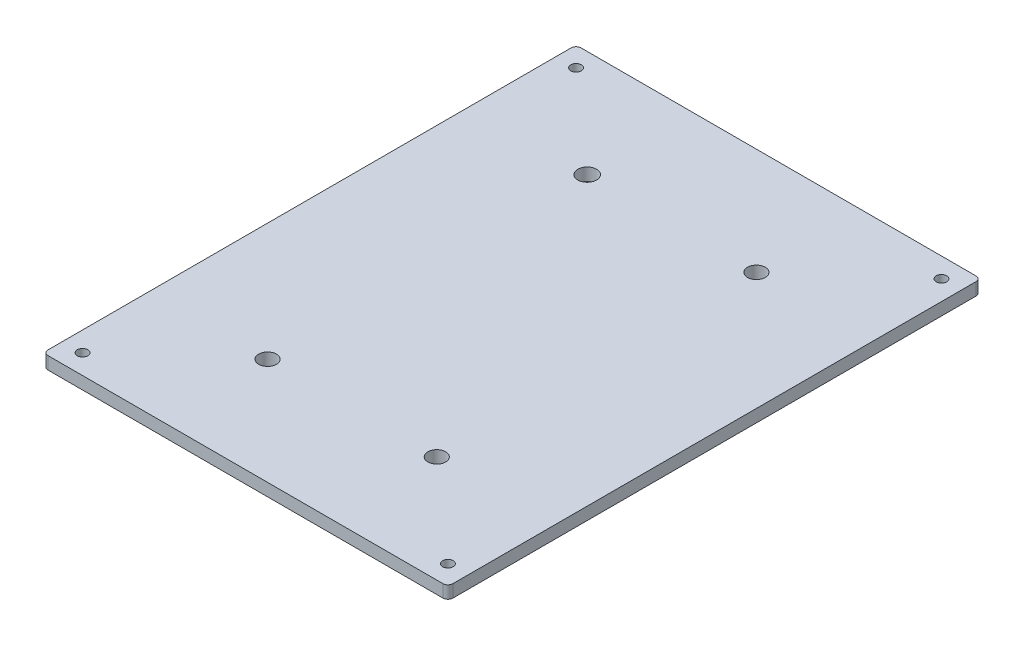
ISO-10303-21;
HEADER;
FILE_DESCRIPTION(('STEP AP214'),'2;1');
FILE_NAME('part.step','',(''),(''),'','','');
FILE_SCHEMA(('AUTOMOTIVE_DESIGN { 1 0 10303 214 1 1 1 1 }'));
ENDSEC;
DATA;
#1=APPLICATION_CONTEXT('core data for automotive mechanical design processes');
#2=APPLICATION_PROTOCOL_DEFINITION('international standard','automotive_design',2000,#1);
#3=PRODUCT_CONTEXT('',#1,'mechanical');
#4=PRODUCT('Part','Part','',(#3));
#5=PRODUCT_RELATED_PRODUCT_CATEGORY('part','',(#4));
#6=PRODUCT_DEFINITION_FORMATION('','',#4);
#7=PRODUCT_DEFINITION_CONTEXT('part definition',#1,'design');
#8=PRODUCT_DEFINITION('design','',#6,#7);
#9=PRODUCT_DEFINITION_SHAPE('','',#8);
#10=(LENGTH_UNIT() NAMED_UNIT(*) SI_UNIT(.MILLI.,.METRE.));
#11=(NAMED_UNIT(*) PLANE_ANGLE_UNIT() SI_UNIT($,.RADIAN.));
#12=(NAMED_UNIT(*) SI_UNIT($,.STERADIAN.) SOLID_ANGLE_UNIT());
#13=UNCERTAINTY_MEASURE_WITH_UNIT(LENGTH_MEASURE(1.E-05),#10,'distance_accuracy_value','');
#14=(GEOMETRIC_REPRESENTATION_CONTEXT(3) GLOBAL_UNCERTAINTY_ASSIGNED_CONTEXT((#13)) GLOBAL_UNIT_ASSIGNED_CONTEXT((#10,
#11,#12)) REPRESENTATION_CONTEXT('',''));
#15=CARTESIAN_POINT('',(0.,0.,0.));
#16=DIRECTION('',(0.,0.,1.));
#17=DIRECTION('',(1.,0.,0.));
#18=AXIS2_PLACEMENT_3D('',#15,#16,#17);
#19=CARTESIAN_POINT('',(-102.55,6.35,-135.));
#20=DIRECTION('',(1.,0.,0.));
#21=DIRECTION('',(0.,0.,-1.));
#22=AXIS2_PLACEMENT_3D('',#19,#20,#21);
#23=PLANE('',#22);
#24=DIRECTION('',(0.,0.,1.));
#25=VECTOR('',#24,1.);
#26=CARTESIAN_POINT('',(-102.55,6.35,-135.));
#27=LINE('',#26,#25);
#28=CARTESIAN_POINT('',(-102.55,6.35,-132.46));
#29=VERTEX_POINT('',#28);
#30=CARTESIAN_POINT('',(-102.55,6.35,132.46));
#31=VERTEX_POINT('',#30);
#32=EDGE_CURVE('E129',#29,#31,#27,.T.);
#33=ORIENTED_EDGE('',*,*,#32,.F.);
#34=DIRECTION('',(0.,-1.,0.));
#35=VECTOR('',#34,1.);
#36=CARTESIAN_POINT('',(-102.55,6.35,-132.46));
#37=LINE('',#36,#35);
#38=CARTESIAN_POINT('',(-102.55,0.,-132.46));
#39=VERTEX_POINT('',#38);
#40=EDGE_CURVE('E114',#29,#39,#37,.T.);
#41=ORIENTED_EDGE('',*,*,#40,.T.);
#42=DIRECTION('',(0.,0.,1.));
#43=VECTOR('',#42,1.);
#44=CARTESIAN_POINT('',(-102.55,0.,-135.));
#45=LINE('',#44,#43);
#46=CARTESIAN_POINT('',(-102.55,0.,132.46));
#47=VERTEX_POINT('',#46);
#48=EDGE_CURVE('E126',#39,#47,#45,.T.);
#49=ORIENTED_EDGE('',*,*,#48,.T.);
#50=DIRECTION('',(0.,-1.,0.));
#51=VECTOR('',#50,1.);
#52=CARTESIAN_POINT('',(-102.55,6.35,132.46));
#53=LINE('',#52,#51);
#54=EDGE_CURVE('E131',#47,#31,#53,.F.);
#55=ORIENTED_EDGE('',*,*,#54,.T.);
#56=EDGE_LOOP('',(#33,#41,#49,#55));
#57=FACE_BOUND('',#56,.T.);
#58=ADVANCED_FACE('F44',(#57),#23,.F.);
#59=CARTESIAN_POINT('',(102.55,6.35,135.));
#60=DIRECTION('',(0.,0.,-1.));
#61=DIRECTION('',(-1.,0.,0.));
#62=AXIS2_PLACEMENT_3D('',#59,#60,#61);
#63=PLANE('',#62);
#64=DIRECTION('',(1.,0.,0.));
#65=VECTOR('',#64,1.);
#66=CARTESIAN_POINT('',(102.55,0.,135.));
#67=LINE('',#66,#65);
#68=CARTESIAN_POINT('',(-100.01,0.,135.));
#69=VERTEX_POINT('',#68);
#70=CARTESIAN_POINT('',(100.01,0.,135.));
#71=VERTEX_POINT('',#70);
#72=EDGE_CURVE('E135',#69,#71,#67,.T.);
#73=ORIENTED_EDGE('',*,*,#72,.T.);
#74=DIRECTION('',(0.,-1.,0.));
#75=VECTOR('',#74,1.);
#76=CARTESIAN_POINT('',(100.01,6.35,135.));
#77=LINE('',#76,#75);
#78=CARTESIAN_POINT('',(100.01,6.35,135.));
#79=VERTEX_POINT('',#78);
#80=EDGE_CURVE('E11',#71,#79,#77,.F.);
#81=ORIENTED_EDGE('',*,*,#80,.T.);
#82=DIRECTION('',(1.,0.,0.));
#83=VECTOR('',#82,1.);
#84=CARTESIAN_POINT('',(102.55,6.35,135.));
#85=LINE('',#84,#83);
#86=CARTESIAN_POINT('',(-100.01,6.35,135.));
#87=VERTEX_POINT('',#86);
#88=EDGE_CURVE('E175',#87,#79,#85,.T.);
#89=ORIENTED_EDGE('',*,*,#88,.F.);
#90=DIRECTION('',(0.,-1.,0.));
#91=VECTOR('',#90,1.);
#92=CARTESIAN_POINT('',(-100.01,6.35,135.));
#93=LINE('',#92,#91);
#94=EDGE_CURVE('E52',#87,#69,#93,.T.);
#95=ORIENTED_EDGE('',*,*,#94,.T.);
#96=EDGE_LOOP('',(#73,#81,#89,#95));
#97=FACE_BOUND('',#96,.T.);
#98=ADVANCED_FACE('F173',(#97),#63,.F.);
#99=CARTESIAN_POINT('',(102.55,6.35,-135.));
#100=DIRECTION('',(-1.,0.,0.));
#101=DIRECTION('',(0.,0.,1.));
#102=AXIS2_PLACEMENT_3D('',#99,#100,#101);
#103=PLANE('',#102);
#104=DIRECTION('',(0.,0.,-1.));
#105=VECTOR('',#104,1.);
#106=CARTESIAN_POINT('',(102.55,0.,-135.));
#107=LINE('',#106,#105);
#108=CARTESIAN_POINT('',(102.55,0.,132.46));
#109=VERTEX_POINT('',#108);
#110=CARTESIAN_POINT('',(102.55,0.,-132.46));
#111=VERTEX_POINT('',#110);
#112=EDGE_CURVE('E139',#109,#111,#107,.T.);
#113=ORIENTED_EDGE('',*,*,#112,.T.);
#114=DIRECTION('',(0.,-1.,0.));
#115=VECTOR('',#114,1.);
#116=CARTESIAN_POINT('',(102.55,6.35,-132.46));
#117=LINE('',#116,#115);
#118=CARTESIAN_POINT('',(102.55,6.35,-132.46));
#119=VERTEX_POINT('',#118);
#120=EDGE_CURVE('E59',#111,#119,#117,.F.);
#121=ORIENTED_EDGE('',*,*,#120,.T.);
#122=DIRECTION('',(0.,0.,-1.));
#123=VECTOR('',#122,1.);
#124=CARTESIAN_POINT('',(102.55,6.35,-135.));
#125=LINE('',#124,#123);
#126=CARTESIAN_POINT('',(102.55,6.35,132.46));
#127=VERTEX_POINT('',#126);
#128=EDGE_CURVE('E183',#127,#119,#125,.T.);
#129=ORIENTED_EDGE('',*,*,#128,.F.);
#130=DIRECTION('',(0.,-1.,0.));
#131=VECTOR('',#130,1.);
#132=CARTESIAN_POINT('',(102.55,6.35,132.46));
#133=LINE('',#132,#131);
#134=EDGE_CURVE('E166',#127,#109,#133,.T.);
#135=ORIENTED_EDGE('',*,*,#134,.T.);
#136=EDGE_LOOP('',(#113,#121,#129,#135));
#137=FACE_BOUND('',#136,.T.);
#138=ADVANCED_FACE('F182',(#137),#103,.F.);
#139=CARTESIAN_POINT('',(102.55,6.35,-135.));
#140=DIRECTION('',(0.,0.,1.));
#141=DIRECTION('',(1.,0.,0.));
#142=AXIS2_PLACEMENT_3D('',#139,#140,#141);
#143=PLANE('',#142);
#144=DIRECTION('',(-1.,0.,0.));
#145=VECTOR('',#144,1.);
#146=CARTESIAN_POINT('',(102.55,0.,-135.));
#147=LINE('',#146,#145);
#148=CARTESIAN_POINT('',(100.01,0.,-135.));
#149=VERTEX_POINT('',#148);
#150=CARTESIAN_POINT('',(-100.01,0.,-135.));
#151=VERTEX_POINT('',#150);
#152=EDGE_CURVE('E149',#149,#151,#147,.T.);
#153=ORIENTED_EDGE('',*,*,#152,.T.);
#154=DIRECTION('',(0.,-1.,0.));
#155=VECTOR('',#154,1.);
#156=CARTESIAN_POINT('',(-100.01,6.35,-135.));
#157=LINE('',#156,#155);
#158=CARTESIAN_POINT('',(-100.01,6.35,-135.));
#159=VERTEX_POINT('',#158);
#160=EDGE_CURVE('E115',#151,#159,#157,.F.);
#161=ORIENTED_EDGE('',*,*,#160,.T.);
#162=DIRECTION('',(-1.,0.,0.));
#163=VECTOR('',#162,1.);
#164=CARTESIAN_POINT('',(102.55,6.35,-135.));
#165=LINE('',#164,#163);
#166=CARTESIAN_POINT('',(100.01,6.35,-135.));
#167=VERTEX_POINT('',#166);
#168=EDGE_CURVE('E145',#167,#159,#165,.T.);
#169=ORIENTED_EDGE('',*,*,#168,.F.);
#170=DIRECTION('',(0.,-1.,0.));
#171=VECTOR('',#170,1.);
#172=CARTESIAN_POINT('',(100.01,6.35,-135.));
#173=LINE('',#172,#171);
#174=EDGE_CURVE('E120',#167,#149,#173,.T.);
#175=ORIENTED_EDGE('',*,*,#174,.T.);
#176=EDGE_LOOP('',(#153,#161,#169,#175));
#177=FACE_BOUND('',#176,.T.);
#178=ADVANCED_FACE('F239',(#177),#143,.F.);
#179=CARTESIAN_POINT('',(0.,6.35,0.));
#180=DIRECTION('',(0.,-1.,0.));
#181=DIRECTION('',(0.,0.,-1.));
#182=AXIS2_PLACEMENT_3D('',#179,#180,#181);
#183=PLANE('',#182);
#184=CARTESIAN_POINT('',(42.8625,6.35,-80.9625));
#185=DIRECTION('',(0.,1.,0.));
#186=DIRECTION('',(0.,0.,1.));
#187=AXIS2_PLACEMENT_3D('',#184,#185,#186);
#188=CIRCLE('',#187,4.50000000000001);
#189=CARTESIAN_POINT('',(42.8625,6.35,-76.4625));
#190=VERTEX_POINT('',#189);
#191=EDGE_CURVE('E219',#190,#190,#188,.T.);
#192=ORIENTED_EDGE('',*,*,#191,.F.);
#193=EDGE_LOOP('',(#192));
#194=FACE_BOUND('',#193,.T.);
#195=CARTESIAN_POINT('',(42.8625,6.35,80.9625));
#196=DIRECTION('',(0.,1.,0.));
#197=DIRECTION('',(0.,0.,1.));
#198=AXIS2_PLACEMENT_3D('',#195,#196,#197);
#199=CIRCLE('',#198,4.5);
#200=CARTESIAN_POINT('',(42.8625,6.35,85.4625));
#201=VERTEX_POINT('',#200);
#202=EDGE_CURVE('E225',#201,#201,#199,.T.);
#203=ORIENTED_EDGE('',*,*,#202,.F.);
#204=EDGE_LOOP('',(#203));
#205=FACE_BOUND('',#204,.T.);
#206=CARTESIAN_POINT('',(-42.8625,6.35,80.9625));
#207=DIRECTION('',(0.,1.,0.));
#208=DIRECTION('',(0.,0.,1.));
#209=AXIS2_PLACEMENT_3D('',#206,#207,#208);
#210=CIRCLE('',#209,4.5);
#211=CARTESIAN_POINT('',(-42.8625,6.35,85.4625));
#212=VERTEX_POINT('',#211);
#213=EDGE_CURVE('E213',#212,#212,#210,.T.);
#214=ORIENTED_EDGE('',*,*,#213,.F.);
#215=EDGE_LOOP('',(#214));
#216=FACE_BOUND('',#215,.T.);
#217=CARTESIAN_POINT('',(-42.8625,6.35,-80.9625));
#218=DIRECTION('',(0.,1.,0.));
#219=DIRECTION('',(0.,0.,1.));
#220=AXIS2_PLACEMENT_3D('',#217,#218,#219);
#221=CIRCLE('',#220,4.7625);
#222=CARTESIAN_POINT('',(-42.8625,6.35,-76.2));
#223=VERTEX_POINT('',#222);
#224=EDGE_CURVE('E196',#223,#223,#221,.T.);
#225=ORIENTED_EDGE('',*,*,#224,.F.);
#226=EDGE_LOOP('',(#225));
#227=FACE_BOUND('',#226,.T.);
#228=CARTESIAN_POINT('',(-92.55,6.35,-125.));
#229=DIRECTION('',(0.,1.,0.));
#230=DIRECTION('',(0.,0.,1.));
#231=AXIS2_PLACEMENT_3D('',#228,#229,#230);
#232=CIRCLE('',#231,2.665);
#233=CARTESIAN_POINT('',(-92.55,6.35,-122.335));
#234=VERTEX_POINT('',#233);
#235=EDGE_CURVE('E195',#234,#234,#232,.T.);
#236=ORIENTED_EDGE('',*,*,#235,.F.);
#237=EDGE_LOOP('',(#236));
#238=FACE_BOUND('',#237,.T.);
#239=CARTESIAN_POINT('',(92.5500000000001,6.35,-125.));
#240=DIRECTION('',(0.,1.,0.));
#241=DIRECTION('',(0.,0.,1.));
#242=AXIS2_PLACEMENT_3D('',#239,#240,#241);
#243=CIRCLE('',#242,2.665);
#244=CARTESIAN_POINT('',(92.5500000000001,6.35,-122.335));
#245=VERTEX_POINT('',#244);
#246=EDGE_CURVE('E202',#245,#245,#243,.T.);
#247=ORIENTED_EDGE('',*,*,#246,.F.);
#248=EDGE_LOOP('',(#247));
#249=FACE_BOUND('',#248,.T.);
#250=CARTESIAN_POINT('',(92.5500000000001,6.35,125.));
#251=DIRECTION('',(0.,1.,0.));
#252=DIRECTION('',(0.,0.,1.));
#253=AXIS2_PLACEMENT_3D('',#250,#251,#252);
#254=CIRCLE('',#253,2.665);
#255=CARTESIAN_POINT('',(92.5500000000001,6.35,127.665));
#256=VERTEX_POINT('',#255);
#257=EDGE_CURVE('E190',#256,#256,#254,.T.);
#258=ORIENTED_EDGE('',*,*,#257,.F.);
#259=EDGE_LOOP('',(#258));
#260=FACE_BOUND('',#259,.T.);
#261=CARTESIAN_POINT('',(-92.55,6.35,125.));
#262=DIRECTION('',(0.,1.,0.));
#263=DIRECTION('',(0.,0.,1.));
#264=AXIS2_PLACEMENT_3D('',#261,#262,#263);
#265=CIRCLE('',#264,2.665);
#266=CARTESIAN_POINT('',(-92.55,6.35,127.665));
#267=VERTEX_POINT('',#266);
#268=EDGE_CURVE('E136',#267,#267,#265,.T.);
#269=ORIENTED_EDGE('',*,*,#268,.F.);
#270=EDGE_LOOP('',(#269));
#271=FACE_BOUND('',#270,.T.);
#272=ORIENTED_EDGE('',*,*,#168,.T.);
#273=CARTESIAN_POINT('',(-100.01,6.35,-132.46));
#274=DIRECTION('',(0.,-1.,0.));
#275=DIRECTION('',(0.,0.,-1.));
#276=AXIS2_PLACEMENT_3D('',#273,#274,#275);
#277=CIRCLE('',#276,2.54);
#278=EDGE_CURVE('E164',#159,#29,#277,.F.);
#279=ORIENTED_EDGE('',*,*,#278,.T.);
#280=ORIENTED_EDGE('',*,*,#32,.T.);
#281=CARTESIAN_POINT('',(-100.01,6.35,132.46));
#282=DIRECTION('',(0.,-1.,0.));
#283=DIRECTION('',(0.,0.,-1.));
#284=AXIS2_PLACEMENT_3D('',#281,#282,#283);
#285=CIRCLE('',#284,2.54);
#286=EDGE_CURVE('E159',#31,#87,#285,.F.);
#287=ORIENTED_EDGE('',*,*,#286,.T.);
#288=ORIENTED_EDGE('',*,*,#88,.T.);
#289=CARTESIAN_POINT('',(100.01,6.35,132.46));
#290=DIRECTION('',(0.,-1.,0.));
#291=DIRECTION('',(0.,0.,-1.));
#292=AXIS2_PLACEMENT_3D('',#289,#290,#291);
#293=CIRCLE('',#292,2.54);
#294=EDGE_CURVE('E66',#79,#127,#293,.F.);
#295=ORIENTED_EDGE('',*,*,#294,.T.);
#296=ORIENTED_EDGE('',*,*,#128,.T.);
#297=CARTESIAN_POINT('',(100.01,6.35,-132.46));
#298=DIRECTION('',(0.,-1.,0.));
#299=DIRECTION('',(0.,0.,-1.));
#300=AXIS2_PLACEMENT_3D('',#297,#298,#299);
#301=CIRCLE('',#300,2.54);
#302=EDGE_CURVE('E162',#119,#167,#301,.F.);
#303=ORIENTED_EDGE('',*,*,#302,.T.);
#304=EDGE_LOOP('',(#272,#279,#280,#287,#288,#295,#296,#303));
#305=FACE_BOUND('',#304,.T.);
#306=ADVANCED_FACE('F236',(#194,#205,#216,#227,#238,#249,#260,#271,#305),#183,.F.);
#307=CARTESIAN_POINT('',(0.,0.,0.));
#308=DIRECTION('',(0.,-1.,0.));
#309=DIRECTION('',(0.,0.,-1.));
#310=AXIS2_PLACEMENT_3D('',#307,#308,#309);
#311=PLANE('',#310);
#312=CARTESIAN_POINT('',(42.8625,0.,-80.9625));
#313=DIRECTION('',(0.,-1.,0.));
#314=DIRECTION('',(0.,0.,-1.));
#315=AXIS2_PLACEMENT_3D('',#312,#313,#314);
#316=CIRCLE('',#315,4.50000000000001);
#317=CARTESIAN_POINT('',(42.8625,0.,-85.4625));
#318=VERTEX_POINT('',#317);
#319=EDGE_CURVE('E216',#318,#318,#316,.F.);
#320=ORIENTED_EDGE('',*,*,#319,.T.);
#321=EDGE_LOOP('',(#320));
#322=FACE_BOUND('',#321,.T.);
#323=CARTESIAN_POINT('',(42.8625,0.,80.9625));
#324=DIRECTION('',(0.,-1.,0.));
#325=DIRECTION('',(0.,0.,-1.));
#326=AXIS2_PLACEMENT_3D('',#323,#324,#325);
#327=CIRCLE('',#326,4.5);
#328=CARTESIAN_POINT('',(42.8625,0.,76.4625));
#329=VERTEX_POINT('',#328);
#330=EDGE_CURVE('E222',#329,#329,#327,.F.);
#331=ORIENTED_EDGE('',*,*,#330,.T.);
#332=EDGE_LOOP('',(#331));
#333=FACE_BOUND('',#332,.T.);
#334=CARTESIAN_POINT('',(-42.8625,0.,80.9625));
#335=DIRECTION('',(0.,-1.,0.));
#336=DIRECTION('',(0.,0.,-1.));
#337=AXIS2_PLACEMENT_3D('',#334,#335,#336);
#338=CIRCLE('',#337,4.5);
#339=CARTESIAN_POINT('',(-42.8625,0.,76.4625));
#340=VERTEX_POINT('',#339);
#341=EDGE_CURVE('E228',#340,#340,#338,.F.);
#342=ORIENTED_EDGE('',*,*,#341,.T.);
#343=EDGE_LOOP('',(#342));
#344=FACE_BOUND('',#343,.T.);
#345=CARTESIAN_POINT('',(-42.8625,0.,-80.9625));
#346=DIRECTION('',(0.,-1.,0.));
#347=DIRECTION('',(0.,0.,-1.));
#348=AXIS2_PLACEMENT_3D('',#345,#346,#347);
#349=CIRCLE('',#348,4.7625);
#350=CARTESIAN_POINT('',(-42.8625,0.,-85.725));
#351=VERTEX_POINT('',#350);
#352=EDGE_CURVE('E210',#351,#351,#349,.F.);
#353=ORIENTED_EDGE('',*,*,#352,.T.);
#354=EDGE_LOOP('',(#353));
#355=FACE_BOUND('',#354,.T.);
#356=CARTESIAN_POINT('',(-92.55,0.,-125.));
#357=DIRECTION('',(0.,-1.,0.));
#358=DIRECTION('',(0.,0.,-1.));
#359=AXIS2_PLACEMENT_3D('',#356,#357,#358);
#360=CIRCLE('',#359,2.665);
#361=CARTESIAN_POINT('',(-92.55,0.,-127.665));
#362=VERTEX_POINT('',#361);
#363=EDGE_CURVE('E192',#362,#362,#360,.F.);
#364=ORIENTED_EDGE('',*,*,#363,.T.);
#365=EDGE_LOOP('',(#364));
#366=FACE_BOUND('',#365,.T.);
#367=CARTESIAN_POINT('',(92.5500000000001,0.,-125.));
#368=DIRECTION('',(0.,-1.,0.));
#369=DIRECTION('',(0.,0.,-1.));
#370=AXIS2_PLACEMENT_3D('',#367,#368,#369);
#371=CIRCLE('',#370,2.665);
#372=CARTESIAN_POINT('',(92.5500000000001,0.,-127.665));
#373=VERTEX_POINT('',#372);
#374=EDGE_CURVE('E199',#373,#373,#371,.F.);
#375=ORIENTED_EDGE('',*,*,#374,.T.);
#376=EDGE_LOOP('',(#375));
#377=FACE_BOUND('',#376,.T.);
#378=CARTESIAN_POINT('',(92.5500000000001,0.,125.));
#379=DIRECTION('',(0.,-1.,0.));
#380=DIRECTION('',(0.,0.,-1.));
#381=AXIS2_PLACEMENT_3D('',#378,#379,#380);
#382=CIRCLE('',#381,2.665);
#383=CARTESIAN_POINT('',(92.5500000000001,0.,122.335));
#384=VERTEX_POINT('',#383);
#385=EDGE_CURVE('E205',#384,#384,#382,.F.);
#386=ORIENTED_EDGE('',*,*,#385,.T.);
#387=EDGE_LOOP('',(#386));
#388=FACE_BOUND('',#387,.T.);
#389=CARTESIAN_POINT('',(-92.55,0.,125.));
#390=DIRECTION('',(0.,-1.,0.));
#391=DIRECTION('',(0.,0.,-1.));
#392=AXIS2_PLACEMENT_3D('',#389,#390,#391);
#393=CIRCLE('',#392,2.665);
#394=CARTESIAN_POINT('',(-92.55,0.,122.335));
#395=VERTEX_POINT('',#394);
#396=EDGE_CURVE('E142',#395,#395,#393,.F.);
#397=ORIENTED_EDGE('',*,*,#396,.T.);
#398=EDGE_LOOP('',(#397));
#399=FACE_BOUND('',#398,.T.);
#400=ORIENTED_EDGE('',*,*,#48,.F.);
#401=CARTESIAN_POINT('',(-100.01,0.,-132.46));
#402=DIRECTION('',(0.,-1.,0.));
#403=DIRECTION('',(0.,0.,-1.));
#404=AXIS2_PLACEMENT_3D('',#401,#402,#403);
#405=CIRCLE('',#404,2.54);
#406=EDGE_CURVE('E110',#39,#151,#405,.T.);
#407=ORIENTED_EDGE('',*,*,#406,.T.);
#408=ORIENTED_EDGE('',*,*,#152,.F.);
#409=CARTESIAN_POINT('',(100.01,0.,-132.46));
#410=DIRECTION('',(0.,-1.,0.));
#411=DIRECTION('',(0.,0.,-1.));
#412=AXIS2_PLACEMENT_3D('',#409,#410,#411);
#413=CIRCLE('',#412,2.54);
#414=EDGE_CURVE('E121',#149,#111,#413,.T.);
#415=ORIENTED_EDGE('',*,*,#414,.T.);
#416=ORIENTED_EDGE('',*,*,#112,.F.);
#417=CARTESIAN_POINT('',(100.01,0.,132.46));
#418=DIRECTION('',(0.,-1.,0.));
#419=DIRECTION('',(0.,0.,-1.));
#420=AXIS2_PLACEMENT_3D('',#417,#418,#419);
#421=CIRCLE('',#420,2.54);
#422=EDGE_CURVE('E153',#109,#71,#421,.T.);
#423=ORIENTED_EDGE('',*,*,#422,.T.);
#424=ORIENTED_EDGE('',*,*,#72,.F.);
#425=CARTESIAN_POINT('',(-100.01,0.,132.46));
#426=DIRECTION('',(0.,-1.,0.));
#427=DIRECTION('',(0.,0.,-1.));
#428=AXIS2_PLACEMENT_3D('',#425,#426,#427);
#429=CIRCLE('',#428,2.54);
#430=EDGE_CURVE('E130',#69,#47,#429,.T.);
#431=ORIENTED_EDGE('',*,*,#430,.T.);
#432=EDGE_LOOP('',(#400,#407,#408,#415,#416,#423,#424,#431));
#433=FACE_BOUND('',#432,.T.);
#434=ADVANCED_FACE('F133',(#322,#333,#344,#355,#366,#377,#388,#399,#433),#311,.T.);
#435=CARTESIAN_POINT('',(-92.55,-0.00100000000000013,125.));
#436=DIRECTION('',(0.,1.,0.));
#437=DIRECTION('',(0.,0.,1.));
#438=AXIS2_PLACEMENT_3D('',#435,#436,#437);
#439=CYLINDRICAL_SURFACE('',#438,2.665);
#440=ORIENTED_EDGE('',*,*,#396,.F.);
#441=EDGE_LOOP('',(#440));
#442=FACE_BOUND('',#441,.T.);
#443=ORIENTED_EDGE('',*,*,#268,.T.);
#444=EDGE_LOOP('',(#443));
#445=FACE_BOUND('',#444,.T.);
#446=ADVANCED_FACE('F276',(#442,#445),#439,.F.);
#447=CARTESIAN_POINT('',(92.5500000000001,-0.00100000000000013,125.));
#448=DIRECTION('',(0.,1.,0.));
#449=DIRECTION('',(0.,0.,1.));
#450=AXIS2_PLACEMENT_3D('',#447,#448,#449);
#451=CYLINDRICAL_SURFACE('',#450,2.665);
#452=ORIENTED_EDGE('',*,*,#385,.F.);
#453=EDGE_LOOP('',(#452));
#454=FACE_BOUND('',#453,.T.);
#455=ORIENTED_EDGE('',*,*,#257,.T.);
#456=EDGE_LOOP('',(#455));
#457=FACE_BOUND('',#456,.T.);
#458=ADVANCED_FACE('F281',(#454,#457),#451,.F.);
#459=CARTESIAN_POINT('',(92.5500000000001,-0.00100000000000013,-125.));
#460=DIRECTION('',(0.,1.,0.));
#461=DIRECTION('',(0.,0.,1.));
#462=AXIS2_PLACEMENT_3D('',#459,#460,#461);
#463=CYLINDRICAL_SURFACE('',#462,2.665);
#464=ORIENTED_EDGE('',*,*,#374,.F.);
#465=EDGE_LOOP('',(#464));
#466=FACE_BOUND('',#465,.T.);
#467=ORIENTED_EDGE('',*,*,#246,.T.);
#468=EDGE_LOOP('',(#467));
#469=FACE_BOUND('',#468,.T.);
#470=ADVANCED_FACE('F287',(#466,#469),#463,.F.);
#471=CARTESIAN_POINT('',(-92.55,-0.00100000000000013,-125.));
#472=DIRECTION('',(0.,1.,0.));
#473=DIRECTION('',(0.,0.,1.));
#474=AXIS2_PLACEMENT_3D('',#471,#472,#473);
#475=CYLINDRICAL_SURFACE('',#474,2.665);
#476=ORIENTED_EDGE('',*,*,#363,.F.);
#477=EDGE_LOOP('',(#476));
#478=FACE_BOUND('',#477,.T.);
#479=ORIENTED_EDGE('',*,*,#235,.T.);
#480=EDGE_LOOP('',(#479));
#481=FACE_BOUND('',#480,.T.);
#482=ADVANCED_FACE('F283',(#478,#481),#475,.F.);
#483=CARTESIAN_POINT('',(-42.8625,-0.00100000000000013,-80.9625));
#484=DIRECTION('',(0.,1.,0.));
#485=DIRECTION('',(0.,0.,1.));
#486=AXIS2_PLACEMENT_3D('',#483,#484,#485);
#487=CYLINDRICAL_SURFACE('',#486,4.7625);
#488=ORIENTED_EDGE('',*,*,#352,.F.);
#489=EDGE_LOOP('',(#488));
#490=FACE_BOUND('',#489,.T.);
#491=ORIENTED_EDGE('',*,*,#224,.T.);
#492=EDGE_LOOP('',(#491));
#493=FACE_BOUND('',#492,.T.);
#494=ADVANCED_FACE('F286',(#490,#493),#487,.F.);
#495=CARTESIAN_POINT('',(-42.8625,-0.00100000000000013,80.9625));
#496=DIRECTION('',(0.,1.,0.));
#497=DIRECTION('',(0.,0.,1.));
#498=AXIS2_PLACEMENT_3D('',#495,#496,#497);
#499=CYLINDRICAL_SURFACE('',#498,4.5);
#500=ORIENTED_EDGE('',*,*,#341,.F.);
#501=EDGE_LOOP('',(#500));
#502=FACE_BOUND('',#501,.T.);
#503=ORIENTED_EDGE('',*,*,#213,.T.);
#504=EDGE_LOOP('',(#503));
#505=FACE_BOUND('',#504,.T.);
#506=ADVANCED_FACE('F234',(#502,#505),#499,.F.);
#507=CARTESIAN_POINT('',(42.8625,-0.00100000000000013,80.9625));
#508=DIRECTION('',(0.,1.,0.));
#509=DIRECTION('',(0.,0.,1.));
#510=AXIS2_PLACEMENT_3D('',#507,#508,#509);
#511=CYLINDRICAL_SURFACE('',#510,4.5);
#512=ORIENTED_EDGE('',*,*,#330,.F.);
#513=EDGE_LOOP('',(#512));
#514=FACE_BOUND('',#513,.T.);
#515=ORIENTED_EDGE('',*,*,#202,.T.);
#516=EDGE_LOOP('',(#515));
#517=FACE_BOUND('',#516,.T.);
#518=ADVANCED_FACE('F300',(#514,#517),#511,.F.);
#519=CARTESIAN_POINT('',(42.8625,-0.00100000000000013,-80.9625));
#520=DIRECTION('',(0.,1.,0.));
#521=DIRECTION('',(0.,0.,1.));
#522=AXIS2_PLACEMENT_3D('',#519,#520,#521);
#523=CYLINDRICAL_SURFACE('',#522,4.50000000000001);
#524=ORIENTED_EDGE('',*,*,#319,.F.);
#525=EDGE_LOOP('',(#524));
#526=FACE_BOUND('',#525,.T.);
#527=ORIENTED_EDGE('',*,*,#191,.T.);
#528=EDGE_LOOP('',(#527));
#529=FACE_BOUND('',#528,.T.);
#530=ADVANCED_FACE('F262',(#526,#529),#523,.F.);
#531=CARTESIAN_POINT('',(-100.01,6.35,-132.46));
#532=DIRECTION('',(0.,-1.,0.));
#533=DIRECTION('',(0.,0.,-1.));
#534=AXIS2_PLACEMENT_3D('',#531,#532,#533);
#535=CYLINDRICAL_SURFACE('',#534,2.54);
#536=ORIENTED_EDGE('',*,*,#278,.F.);
#537=ORIENTED_EDGE('',*,*,#160,.F.);
#538=ORIENTED_EDGE('',*,*,#406,.F.);
#539=ORIENTED_EDGE('',*,*,#40,.F.);
#540=EDGE_LOOP('',(#536,#537,#538,#539));
#541=FACE_BOUND('',#540,.T.);
#542=ADVANCED_FACE('F113',(#541),#535,.T.);
#543=CARTESIAN_POINT('',(100.01,6.35,-132.46));
#544=DIRECTION('',(0.,-1.,0.));
#545=DIRECTION('',(0.,0.,-1.));
#546=AXIS2_PLACEMENT_3D('',#543,#544,#545);
#547=CYLINDRICAL_SURFACE('',#546,2.54);
#548=ORIENTED_EDGE('',*,*,#302,.F.);
#549=ORIENTED_EDGE('',*,*,#120,.F.);
#550=ORIENTED_EDGE('',*,*,#414,.F.);
#551=ORIENTED_EDGE('',*,*,#174,.F.);
#552=EDGE_LOOP('',(#548,#549,#550,#551));
#553=FACE_BOUND('',#552,.T.);
#554=ADVANCED_FACE('F255',(#553),#547,.T.);
#555=CARTESIAN_POINT('',(100.01,6.35,132.46));
#556=DIRECTION('',(0.,-1.,0.));
#557=DIRECTION('',(0.,0.,-1.));
#558=AXIS2_PLACEMENT_3D('',#555,#556,#557);
#559=CYLINDRICAL_SURFACE('',#558,2.54);
#560=ORIENTED_EDGE('',*,*,#294,.F.);
#561=ORIENTED_EDGE('',*,*,#80,.F.);
#562=ORIENTED_EDGE('',*,*,#422,.F.);
#563=ORIENTED_EDGE('',*,*,#134,.F.);
#564=EDGE_LOOP('',(#560,#561,#562,#563));
#565=FACE_BOUND('',#564,.T.);
#566=ADVANCED_FACE('F181',(#565),#559,.T.);
#567=CARTESIAN_POINT('',(-100.01,6.35,132.46));
#568=DIRECTION('',(0.,-1.,0.));
#569=DIRECTION('',(0.,0.,-1.));
#570=AXIS2_PLACEMENT_3D('',#567,#568,#569);
#571=CYLINDRICAL_SURFACE('',#570,2.54);
#572=ORIENTED_EDGE('',*,*,#286,.F.);
#573=ORIENTED_EDGE('',*,*,#54,.F.);
#574=ORIENTED_EDGE('',*,*,#430,.F.);
#575=ORIENTED_EDGE('',*,*,#94,.F.);
#576=EDGE_LOOP('',(#572,#573,#574,#575));
#577=FACE_BOUND('',#576,.T.);
#578=ADVANCED_FACE('F46',(#577),#571,.T.);
#579=CLOSED_SHELL('',(#58,#98,#138,#178,#306,#434,#446,#458,#470,#482,#494,#506,#518,#530,#542,
#554,#566,#578));
#580=MANIFOLD_SOLID_BREP('B2',#579);
#581=ADVANCED_BREP_SHAPE_REPRESENTATION('',(#18,#580),#14);
#582=SHAPE_DEFINITION_REPRESENTATION(#9,#581);
ENDSEC;
END-ISO-10303-21;
